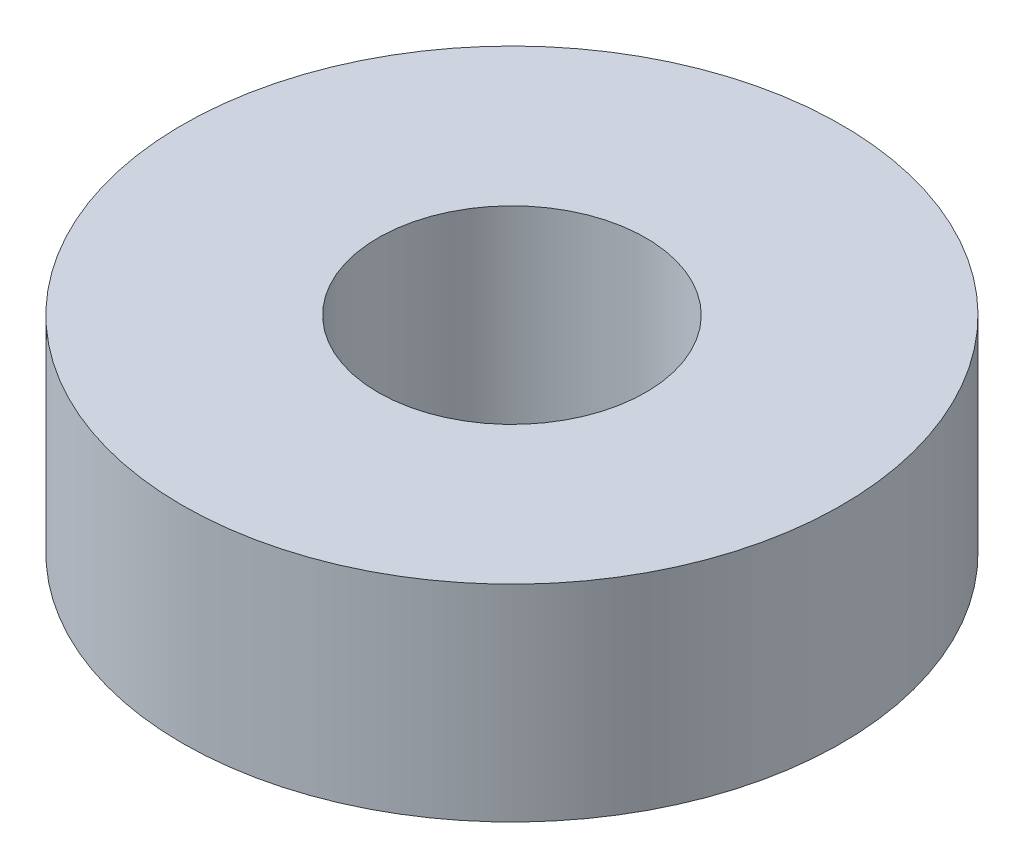
ISO-10303-21;
HEADER;
FILE_DESCRIPTION(('STEP AP214'),'2;1');
FILE_NAME('part.step','',(''),(''),'','','');
FILE_SCHEMA(('AUTOMOTIVE_DESIGN { 1 0 10303 214 1 1 1 1 }'));
ENDSEC;
DATA;
#1=APPLICATION_CONTEXT('core data for automotive mechanical design processes');
#2=APPLICATION_PROTOCOL_DEFINITION('international standard','automotive_design',2000,#1);
#3=PRODUCT_CONTEXT('',#1,'mechanical');
#4=PRODUCT('Part','Part','',(#3));
#5=PRODUCT_RELATED_PRODUCT_CATEGORY('part','',(#4));
#6=PRODUCT_DEFINITION_FORMATION('','',#4);
#7=PRODUCT_DEFINITION_CONTEXT('part definition',#1,'design');
#8=PRODUCT_DEFINITION('design','',#6,#7);
#9=PRODUCT_DEFINITION_SHAPE('','',#8);
#10=(LENGTH_UNIT() NAMED_UNIT(*) SI_UNIT(.MILLI.,.METRE.));
#11=(NAMED_UNIT(*) PLANE_ANGLE_UNIT() SI_UNIT($,.RADIAN.));
#12=(NAMED_UNIT(*) SI_UNIT($,.STERADIAN.) SOLID_ANGLE_UNIT());
#13=UNCERTAINTY_MEASURE_WITH_UNIT(LENGTH_MEASURE(1.E-05),#10,'distance_accuracy_value','');
#14=(GEOMETRIC_REPRESENTATION_CONTEXT(3) GLOBAL_UNCERTAINTY_ASSIGNED_CONTEXT((#13)) GLOBAL_UNIT_ASSIGNED_CONTEXT((#10,
#11,#12)) REPRESENTATION_CONTEXT('',''));
#15=CARTESIAN_POINT('',(0.,0.,0.));
#16=DIRECTION('',(0.,0.,1.));
#17=DIRECTION('',(1.,0.,0.));
#18=AXIS2_PLACEMENT_3D('',#15,#16,#17);
#19=CARTESIAN_POINT('',(0.,15.,0.));
#20=DIRECTION('',(0.,1.,0.));
#21=DIRECTION('',(0.,0.,1.));
#22=AXIS2_PLACEMENT_3D('',#19,#20,#21);
#23=PLANE('',#22);
#24=CARTESIAN_POINT('',(0.,15.,0.));
#25=DIRECTION('',(0.,1.,0.));
#26=DIRECTION('',(0.,0.,1.));
#27=AXIS2_PLACEMENT_3D('',#24,#25,#26);
#28=CIRCLE('',#27,24.);
#29=CARTESIAN_POINT('',(0.,15.,24.));
#30=VERTEX_POINT('',#29);
#31=EDGE_CURVE('E10',#30,#30,#28,.T.);
#32=ORIENTED_EDGE('',*,*,#31,.T.);
#33=EDGE_LOOP('',(#32));
#34=FACE_BOUND('',#33,.T.);
#35=CARTESIAN_POINT('',(0.,15.,0.));
#36=DIRECTION('',(0.,1.,0.));
#37=DIRECTION('',(0.,0.,1.));
#38=AXIS2_PLACEMENT_3D('',#35,#36,#37);
#39=CIRCLE('',#38,9.75);
#40=CARTESIAN_POINT('',(0.,15.,9.75));
#41=VERTEX_POINT('',#40);
#42=EDGE_CURVE('E48',#41,#41,#39,.T.);
#43=ORIENTED_EDGE('',*,*,#42,.F.);
#44=EDGE_LOOP('',(#43));
#45=FACE_BOUND('',#44,.T.);
#46=ADVANCED_FACE('F37',(#34,#45),#23,.T.);
#47=CARTESIAN_POINT('',(0.,0.,0.));
#48=DIRECTION('',(0.,1.,0.));
#49=DIRECTION('',(0.,0.,1.));
#50=AXIS2_PLACEMENT_3D('',#47,#48,#49);
#51=PLANE('',#50);
#52=CARTESIAN_POINT('',(0.,0.,0.));
#53=DIRECTION('',(0.,1.,0.));
#54=DIRECTION('',(0.,0.,1.));
#55=AXIS2_PLACEMENT_3D('',#52,#53,#54);
#56=CIRCLE('',#55,24.);
#57=CARTESIAN_POINT('',(0.,0.,24.));
#58=VERTEX_POINT('',#57);
#59=EDGE_CURVE('E41',#58,#58,#56,.T.);
#60=ORIENTED_EDGE('',*,*,#59,.F.);
#61=EDGE_LOOP('',(#60));
#62=FACE_BOUND('',#61,.T.);
#63=CARTESIAN_POINT('',(0.,0.,0.));
#64=DIRECTION('',(0.,1.,0.));
#65=DIRECTION('',(0.,0.,1.));
#66=AXIS2_PLACEMENT_3D('',#63,#64,#65);
#67=CIRCLE('',#66,9.75);
#68=CARTESIAN_POINT('',(0.,0.,9.75));
#69=VERTEX_POINT('',#68);
#70=EDGE_CURVE('E50',#69,#69,#67,.T.);
#71=ORIENTED_EDGE('',*,*,#70,.T.);
#72=EDGE_LOOP('',(#71));
#73=FACE_BOUND('',#72,.T.);
#74=ADVANCED_FACE('F60',(#62,#73),#51,.F.);
#75=CARTESIAN_POINT('',(0.,15.,0.));
#76=DIRECTION('',(0.,-1.,0.));
#77=DIRECTION('',(0.,0.,-1.));
#78=AXIS2_PLACEMENT_3D('',#75,#76,#77);
#79=CYLINDRICAL_SURFACE('',#78,24.);
#80=ORIENTED_EDGE('',*,*,#31,.F.);
#81=EDGE_LOOP('',(#80));
#82=FACE_BOUND('',#81,.T.);
#83=ORIENTED_EDGE('',*,*,#59,.T.);
#84=EDGE_LOOP('',(#83));
#85=FACE_BOUND('',#84,.T.);
#86=ADVANCED_FACE('F39',(#82,#85),#79,.T.);
#87=CARTESIAN_POINT('',(0.,15.,0.));
#88=DIRECTION('',(0.,-1.,0.));
#89=DIRECTION('',(0.,0.,-1.));
#90=AXIS2_PLACEMENT_3D('',#87,#88,#89);
#91=CYLINDRICAL_SURFACE('',#90,9.75);
#92=ORIENTED_EDGE('',*,*,#42,.T.);
#93=EDGE_LOOP('',(#92));
#94=FACE_BOUND('',#93,.T.);
#95=ORIENTED_EDGE('',*,*,#70,.F.);
#96=EDGE_LOOP('',(#95));
#97=FACE_BOUND('',#96,.T.);
#98=ADVANCED_FACE('F56',(#94,#97),#91,.F.);
#99=CLOSED_SHELL('',(#46,#74,#86,#98));
#100=MANIFOLD_SOLID_BREP('B2',#99);
#101=ADVANCED_BREP_SHAPE_REPRESENTATION('',(#18,#100),#14);
#102=SHAPE_DEFINITION_REPRESENTATION(#9,#101);
ENDSEC;
END-ISO-10303-21;
